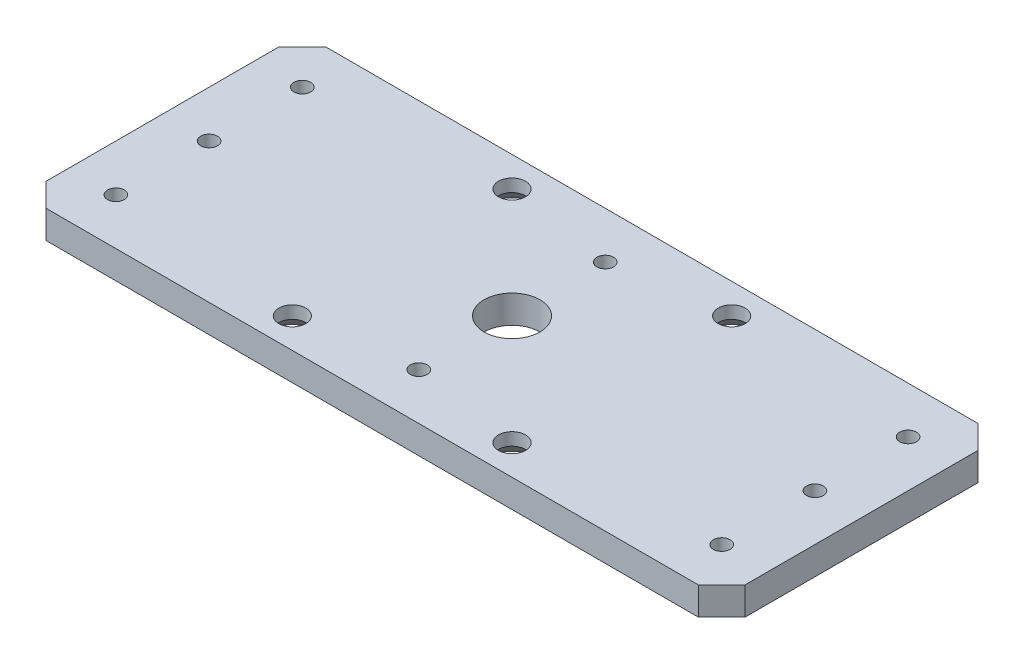
ISO-10303-21;
HEADER;
FILE_DESCRIPTION(('STEP AP214'),'2;1');
FILE_NAME('part.step','',(''),(''),'','','');
FILE_SCHEMA(('AUTOMOTIVE_DESIGN { 1 0 10303 214 1 1 1 1 }'));
ENDSEC;
DATA;
#1=APPLICATION_CONTEXT('core data for automotive mechanical design processes');
#2=APPLICATION_PROTOCOL_DEFINITION('international standard','automotive_design',2000,#1);
#3=PRODUCT_CONTEXT('',#1,'mechanical');
#4=PRODUCT('Part','Part','',(#3));
#5=PRODUCT_RELATED_PRODUCT_CATEGORY('part','',(#4));
#6=PRODUCT_DEFINITION_FORMATION('','',#4);
#7=PRODUCT_DEFINITION_CONTEXT('part definition',#1,'design');
#8=PRODUCT_DEFINITION('design','',#6,#7);
#9=PRODUCT_DEFINITION_SHAPE('','',#8);
#10=(LENGTH_UNIT() NAMED_UNIT(*) SI_UNIT(.MILLI.,.METRE.));
#11=(NAMED_UNIT(*) PLANE_ANGLE_UNIT() SI_UNIT($,.RADIAN.));
#12=(NAMED_UNIT(*) SI_UNIT($,.STERADIAN.) SOLID_ANGLE_UNIT());
#13=UNCERTAINTY_MEASURE_WITH_UNIT(LENGTH_MEASURE(1.E-05),#10,'distance_accuracy_value','');
#14=(GEOMETRIC_REPRESENTATION_CONTEXT(3) GLOBAL_UNCERTAINTY_ASSIGNED_CONTEXT((#13)) GLOBAL_UNIT_ASSIGNED_CONTEXT((#10,
#11,#12)) REPRESENTATION_CONTEXT('',''));
#15=CARTESIAN_POINT('',(0.,0.,0.));
#16=DIRECTION('',(0.,0.,1.));
#17=DIRECTION('',(1.,0.,0.));
#18=AXIS2_PLACEMENT_3D('',#15,#16,#17);
#19=CARTESIAN_POINT('',(0.,94.9999999999997,30.0000000000001));
#20=DIRECTION('',(0.,1.,0.));
#21=DIRECTION('',(-1.,0.,0.));
#22=AXIS2_PLACEMENT_3D('',#19,#20,#21);
#23=PLANE('',#22);
#24=CARTESIAN_POINT('',(-65.,94.9999999999998,9.99999999999992));
#25=DIRECTION('',(0.,1.,0.));
#26=DIRECTION('',(-1.,0.,0.));
#27=AXIS2_PLACEMENT_3D('',#24,#25,#26);
#28=CIRCLE('',#27,1.8);
#29=CARTESIAN_POINT('',(-66.8,94.9999999999998,9.99999999999992));
#30=VERTEX_POINT('',#29);
#31=EDGE_CURVE('E316',#30,#30,#28,.T.);
#32=ORIENTED_EDGE('',*,*,#31,.T.);
#33=EDGE_LOOP('',(#32));
#34=FACE_BOUND('',#33,.T.);
#35=CARTESIAN_POINT('',(-65.,94.9999999999998,30.));
#36=DIRECTION('',(0.,1.,0.));
#37=DIRECTION('',(-1.,0.,0.));
#38=AXIS2_PLACEMENT_3D('',#35,#36,#37);
#39=CIRCLE('',#38,1.8);
#40=CARTESIAN_POINT('',(-66.8,94.9999999999998,30.));
#41=VERTEX_POINT('',#40);
#42=EDGE_CURVE('E310',#41,#41,#39,.T.);
#43=ORIENTED_EDGE('',*,*,#42,.T.);
#44=EDGE_LOOP('',(#43));
#45=FACE_BOUND('',#44,.T.);
#46=CARTESIAN_POINT('',(-65.,94.9999999999998,50.0000000000001));
#47=DIRECTION('',(0.,1.,0.));
#48=DIRECTION('',(-1.,0.,0.));
#49=AXIS2_PLACEMENT_3D('',#46,#47,#48);
#50=CIRCLE('',#49,1.8);
#51=CARTESIAN_POINT('',(-66.8,94.9999999999998,50.0000000000001));
#52=VERTEX_POINT('',#51);
#53=EDGE_CURVE('E304',#52,#52,#50,.T.);
#54=ORIENTED_EDGE('',*,*,#53,.T.);
#55=EDGE_LOOP('',(#54));
#56=FACE_BOUND('',#55,.T.);
#57=CARTESIAN_POINT('',(0.,94.9999999999997,9.99999999999993));
#58=DIRECTION('',(0.,1.,0.));
#59=DIRECTION('',(-1.,0.,0.));
#60=AXIS2_PLACEMENT_3D('',#57,#58,#59);
#61=CIRCLE('',#60,1.8);
#62=CARTESIAN_POINT('',(-1.79999999999999,94.9999999999997,9.99999999999993));
#63=VERTEX_POINT('',#62);
#64=EDGE_CURVE('E298',#63,#63,#61,.T.);
#65=ORIENTED_EDGE('',*,*,#64,.T.);
#66=EDGE_LOOP('',(#65));
#67=FACE_BOUND('',#66,.T.);
#68=CARTESIAN_POINT('',(0.,94.9999999999997,50.0000000000001));
#69=DIRECTION('',(0.,1.,0.));
#70=DIRECTION('',(-1.,0.,0.));
#71=AXIS2_PLACEMENT_3D('',#68,#69,#70);
#72=CIRCLE('',#71,1.8);
#73=CARTESIAN_POINT('',(-1.8,94.9999999999997,50.0000000000001));
#74=VERTEX_POINT('',#73);
#75=EDGE_CURVE('E292',#74,#74,#72,.T.);
#76=ORIENTED_EDGE('',*,*,#75,.T.);
#77=EDGE_LOOP('',(#76));
#78=FACE_BOUND('',#77,.T.);
#79=CARTESIAN_POINT('',(65.,94.9999999999997,9.99999999999993));
#80=DIRECTION('',(0.,1.,0.));
#81=DIRECTION('',(-1.,0.,0.));
#82=AXIS2_PLACEMENT_3D('',#79,#80,#81);
#83=CIRCLE('',#82,1.8);
#84=CARTESIAN_POINT('',(63.2,94.9999999999997,9.99999999999993));
#85=VERTEX_POINT('',#84);
#86=EDGE_CURVE('E286',#85,#85,#83,.T.);
#87=ORIENTED_EDGE('',*,*,#86,.T.);
#88=EDGE_LOOP('',(#87));
#89=FACE_BOUND('',#88,.T.);
#90=CARTESIAN_POINT('',(65.,94.9999999999997,30.));
#91=DIRECTION('',(0.,1.,0.));
#92=DIRECTION('',(-1.,0.,0.));
#93=AXIS2_PLACEMENT_3D('',#90,#91,#92);
#94=CIRCLE('',#93,1.8);
#95=CARTESIAN_POINT('',(63.2,94.9999999999997,30.));
#96=VERTEX_POINT('',#95);
#97=EDGE_CURVE('E280',#96,#96,#94,.T.);
#98=ORIENTED_EDGE('',*,*,#97,.T.);
#99=EDGE_LOOP('',(#98));
#100=FACE_BOUND('',#99,.T.);
#101=CARTESIAN_POINT('',(65.,94.9999999999997,50.0000000000001));
#102=DIRECTION('',(0.,1.,0.));
#103=DIRECTION('',(-1.,0.,0.));
#104=AXIS2_PLACEMENT_3D('',#101,#102,#103);
#105=CIRCLE('',#104,1.8);
#106=CARTESIAN_POINT('',(63.2,94.9999999999997,50.0000000000001));
#107=VERTEX_POINT('',#106);
#108=EDGE_CURVE('E274',#107,#107,#105,.T.);
#109=ORIENTED_EDGE('',*,*,#108,.T.);
#110=EDGE_LOOP('',(#109));
#111=FACE_BOUND('',#110,.T.);
#112=CARTESIAN_POINT('',(23.5699999999999,94.9999999999997,53.5700000000001));
#113=DIRECTION('',(0.,-1.,0.));
#114=DIRECTION('',(0.,0.,-1.));
#115=AXIS2_PLACEMENT_3D('',#112,#113,#114);
#116=CIRCLE('',#115,6.199998);
#117=CARTESIAN_POINT('',(23.5699999999999,94.9999999999997,47.3700020000001));
#118=VERTEX_POINT('',#117);
#119=EDGE_CURVE('E271',#118,#118,#116,.T.);
#120=ORIENTED_EDGE('',*,*,#119,.F.);
#121=EDGE_LOOP('',(#120));
#122=FACE_BOUND('',#121,.T.);
#123=CARTESIAN_POINT('',(-23.5700000000001,94.9999999999997,53.5700000000001));
#124=DIRECTION('',(0.,-1.,0.));
#125=DIRECTION('',(0.,0.,-1.));
#126=AXIS2_PLACEMENT_3D('',#123,#124,#125);
#127=CIRCLE('',#126,6.199998);
#128=CARTESIAN_POINT('',(-23.5700000000001,94.9999999999997,47.3700020000001));
#129=VERTEX_POINT('',#128);
#130=EDGE_CURVE('E262',#129,#129,#127,.T.);
#131=ORIENTED_EDGE('',*,*,#130,.F.);
#132=EDGE_LOOP('',(#131));
#133=FACE_BOUND('',#132,.T.);
#134=CARTESIAN_POINT('',(-23.5700000000001,94.9999999999997,6.43000000000012));
#135=DIRECTION('',(0.,-1.,0.));
#136=DIRECTION('',(0.,0.,-1.));
#137=AXIS2_PLACEMENT_3D('',#134,#135,#136);
#138=CIRCLE('',#137,6.199998);
#139=CARTESIAN_POINT('',(-23.5700000000001,94.9999999999997,0.230002000000121));
#140=VERTEX_POINT('',#139);
#141=EDGE_CURVE('E253',#140,#140,#138,.T.);
#142=ORIENTED_EDGE('',*,*,#141,.F.);
#143=EDGE_LOOP('',(#142));
#144=FACE_BOUND('',#143,.T.);
#145=CARTESIAN_POINT('',(0.,94.9999999999998,30.0000000000001));
#146=DIRECTION('',(0.,1.,0.));
#147=DIRECTION('',(0.,0.,1.));
#148=AXIS2_PLACEMENT_3D('',#145,#146,#147);
#149=CIRCLE('',#148,6.);
#150=CARTESIAN_POINT('',(0.,94.9999999999998,36.0000000000001));
#151=VERTEX_POINT('',#150);
#152=EDGE_CURVE('E135',#151,#151,#149,.T.);
#153=ORIENTED_EDGE('',*,*,#152,.T.);
#154=EDGE_LOOP('',(#153));
#155=FACE_BOUND('',#154,.T.);
#156=DIRECTION('',(1.,0.,0.));
#157=VECTOR('',#156,1.);
#158=CARTESIAN_POINT('',(-75.,94.9999999999997,60.0000000000001));
#159=LINE('',#158,#157);
#160=CARTESIAN_POINT('',(-70.,94.9999999999997,60.0000000000001));
#161=VERTEX_POINT('',#160);
#162=CARTESIAN_POINT('',(70.,94.9999999999997,60.0000000000001));
#163=VERTEX_POINT('',#162);
#164=EDGE_CURVE('E163',#161,#163,#159,.T.);
#165=ORIENTED_EDGE('',*,*,#164,.F.);
#166=DIRECTION('',(0.70710678118655,0.,0.707106781186546));
#167=VECTOR('',#166,1.);
#168=CARTESIAN_POINT('',(-75.,94.9999999999998,55.0000000000001));
#169=LINE('',#168,#167);
#170=CARTESIAN_POINT('',(-75.,94.9999999999998,55.0000000000001));
#171=VERTEX_POINT('',#170);
#172=EDGE_CURVE('E149',#161,#171,#169,.F.);
#173=ORIENTED_EDGE('',*,*,#172,.T.);
#174=DIRECTION('',(0.,0.,1.));
#175=VECTOR('',#174,1.);
#176=CARTESIAN_POINT('',(-75.,94.9999999999998,0.));
#177=LINE('',#176,#175);
#178=CARTESIAN_POINT('',(-75.,94.9999999999998,5.00000000000002));
#179=VERTEX_POINT('',#178);
#180=EDGE_CURVE('E159',#179,#171,#177,.T.);
#181=ORIENTED_EDGE('',*,*,#180,.F.);
#182=DIRECTION('',(-0.707106781186549,0.,0.707106781186547));
#183=VECTOR('',#182,1.);
#184=CARTESIAN_POINT('',(-75.,94.9999999999998,5.00000000000002));
#185=LINE('',#184,#183);
#186=CARTESIAN_POINT('',(-70.,94.9999999999997,0.));
#187=VERTEX_POINT('',#186);
#188=EDGE_CURVE('E129',#179,#187,#185,.F.);
#189=ORIENTED_EDGE('',*,*,#188,.T.);
#190=DIRECTION('',(-1.,0.,0.));
#191=VECTOR('',#190,1.);
#192=CARTESIAN_POINT('',(75.,94.9999999999997,0.));
#193=LINE('',#192,#191);
#194=CARTESIAN_POINT('',(70.,94.9999999999997,0.));
#195=VERTEX_POINT('',#194);
#196=EDGE_CURVE('E158',#195,#187,#193,.T.);
#197=ORIENTED_EDGE('',*,*,#196,.F.);
#198=DIRECTION('',(-0.707106781186547,0.,-0.707106781186549));
#199=VECTOR('',#198,1.);
#200=CARTESIAN_POINT('',(70.,94.9999999999997,0.));
#201=LINE('',#200,#199);
#202=CARTESIAN_POINT('',(75.,94.9999999999997,5.));
#203=VERTEX_POINT('',#202);
#204=EDGE_CURVE('E54',#195,#203,#201,.F.);
#205=ORIENTED_EDGE('',*,*,#204,.T.);
#206=DIRECTION('',(0.,0.,1.));
#207=VECTOR('',#206,1.);
#208=CARTESIAN_POINT('',(75.,94.9999999999997,60.0000000000001));
#209=LINE('',#208,#207);
#210=CARTESIAN_POINT('',(75.,94.9999999999997,55.0000000000001));
#211=VERTEX_POINT('',#210);
#212=EDGE_CURVE('E160',#211,#203,#209,.F.);
#213=ORIENTED_EDGE('',*,*,#212,.F.);
#214=DIRECTION('',(0.70710678118655,0.,-0.707106781186545));
#215=VECTOR('',#214,1.);
#216=CARTESIAN_POINT('',(75.,94.9999999999997,55.0000000000001));
#217=LINE('',#216,#215);
#218=EDGE_CURVE('E62',#211,#163,#217,.F.);
#219=ORIENTED_EDGE('',*,*,#218,.T.);
#220=EDGE_LOOP('',(#165,#173,#181,#189,#197,#205,#213,#219));
#221=FACE_BOUND('',#220,.T.);
#222=CARTESIAN_POINT('',(23.5699999999999,94.9999999999997,6.43000000000012));
#223=DIRECTION('',(0.,-1.,0.));
#224=DIRECTION('',(0.,0.,-1.));
#225=AXIS2_PLACEMENT_3D('',#222,#223,#224);
#226=CIRCLE('',#225,6.199998);
#227=CARTESIAN_POINT('',(23.5699999999999,94.9999999999997,0.230002000000121));
#228=VERTEX_POINT('',#227);
#229=EDGE_CURVE('E177',#228,#228,#226,.T.);
#230=ORIENTED_EDGE('',*,*,#229,.F.);
#231=EDGE_LOOP('',(#230));
#232=FACE_BOUND('',#231,.T.);
#233=ADVANCED_FACE('F39',(#34,#45,#56,#67,#78,#89,#100,#111,#122,#133,#144,#155,#221,#232),#23,.F.);
#234=CARTESIAN_POINT('',(-75.,94.9999999999997,60.0000000000001));
#235=DIRECTION('',(0.,0.,1.));
#236=DIRECTION('',(1.,0.,0.));
#237=AXIS2_PLACEMENT_3D('',#234,#235,#236);
#238=PLANE('',#237);
#239=DIRECTION('',(-1.,0.,0.));
#240=VECTOR('',#239,1.);
#241=CARTESIAN_POINT('',(0.,101.,60.0000000000001));
#242=LINE('',#241,#240);
#243=CARTESIAN_POINT('',(-70.,101.,60.0000000000001));
#244=VERTEX_POINT('',#243);
#245=CARTESIAN_POINT('',(70.,101.,60.0000000000001));
#246=VERTEX_POINT('',#245);
#247=EDGE_CURVE('E184',#244,#246,#242,.F.);
#248=ORIENTED_EDGE('',*,*,#247,.F.);
#249=DIRECTION('',(0.,-1.,0.));
#250=VECTOR('',#249,1.);
#251=CARTESIAN_POINT('',(-70.,94.9999999999997,60.0000000000001));
#252=LINE('',#251,#250);
#253=EDGE_CURVE('E144',#244,#161,#252,.T.);
#254=ORIENTED_EDGE('',*,*,#253,.T.);
#255=ORIENTED_EDGE('',*,*,#164,.T.);
#256=DIRECTION('',(0.,1.,0.));
#257=VECTOR('',#256,1.);
#258=CARTESIAN_POINT('',(70.,94.9999999999995,60.0000000000001));
#259=LINE('',#258,#257);
#260=EDGE_CURVE('E142',#163,#246,#259,.T.);
#261=ORIENTED_EDGE('',*,*,#260,.T.);
#262=EDGE_LOOP('',(#248,#254,#255,#261));
#263=FACE_BOUND('',#262,.T.);
#264=ADVANCED_FACE('F209',(#263),#238,.T.);
#265=CARTESIAN_POINT('',(75.,94.9999999999997,60.0000000000001));
#266=DIRECTION('',(1.,0.,0.));
#267=DIRECTION('',(0.,1.,0.));
#268=AXIS2_PLACEMENT_3D('',#265,#266,#267);
#269=PLANE('',#268);
#270=DIRECTION('',(0.,0.,1.));
#271=VECTOR('',#270,1.);
#272=CARTESIAN_POINT('',(75.,101.,30.0000000000001));
#273=LINE('',#272,#271);
#274=CARTESIAN_POINT('',(75.,101.,55.0000000000001));
#275=VERTEX_POINT('',#274);
#276=CARTESIAN_POINT('',(75.,101.,5.));
#277=VERTEX_POINT('',#276);
#278=EDGE_CURVE('E182',#275,#277,#273,.F.);
#279=ORIENTED_EDGE('',*,*,#278,.F.);
#280=DIRECTION('',(0.,-1.,0.));
#281=VECTOR('',#280,1.);
#282=CARTESIAN_POINT('',(75.,94.9999999999997,55.0000000000001));
#283=LINE('',#282,#281);
#284=EDGE_CURVE('E153',#275,#211,#283,.T.);
#285=ORIENTED_EDGE('',*,*,#284,.T.);
#286=ORIENTED_EDGE('',*,*,#212,.T.);
#287=DIRECTION('',(0.,1.,0.));
#288=VECTOR('',#287,1.);
#289=CARTESIAN_POINT('',(75.,94.9999999999997,5.));
#290=LINE('',#289,#288);
#291=EDGE_CURVE('E151',#203,#277,#290,.T.);
#292=ORIENTED_EDGE('',*,*,#291,.T.);
#293=EDGE_LOOP('',(#279,#285,#286,#292));
#294=FACE_BOUND('',#293,.T.);
#295=ADVANCED_FACE('F216',(#294),#269,.T.);
#296=CARTESIAN_POINT('',(75.,94.9999999999997,0.));
#297=DIRECTION('',(0.,0.,-1.));
#298=DIRECTION('',(-1.,0.,0.));
#299=AXIS2_PLACEMENT_3D('',#296,#297,#298);
#300=PLANE('',#299);
#301=DIRECTION('',(-1.,0.,0.));
#302=VECTOR('',#301,1.);
#303=CARTESIAN_POINT('',(0.,101.,0.));
#304=LINE('',#303,#302);
#305=CARTESIAN_POINT('',(70.,101.,0.));
#306=VERTEX_POINT('',#305);
#307=CARTESIAN_POINT('',(-70.,101.,0.));
#308=VERTEX_POINT('',#307);
#309=EDGE_CURVE('E112',#306,#308,#304,.T.);
#310=ORIENTED_EDGE('',*,*,#309,.F.);
#311=DIRECTION('',(0.,-1.,0.));
#312=VECTOR('',#311,1.);
#313=CARTESIAN_POINT('',(70.,94.9999999999997,0.));
#314=LINE('',#313,#312);
#315=EDGE_CURVE('E11',#306,#195,#314,.T.);
#316=ORIENTED_EDGE('',*,*,#315,.T.);
#317=ORIENTED_EDGE('',*,*,#196,.T.);
#318=DIRECTION('',(0.,1.,0.));
#319=VECTOR('',#318,1.);
#320=CARTESIAN_POINT('',(-70.,94.9999999999999,0.));
#321=LINE('',#320,#319);
#322=EDGE_CURVE('E47',#187,#308,#321,.T.);
#323=ORIENTED_EDGE('',*,*,#322,.T.);
#324=EDGE_LOOP('',(#310,#316,#317,#323));
#325=FACE_BOUND('',#324,.T.);
#326=ADVANCED_FACE('F156',(#325),#300,.T.);
#327=CARTESIAN_POINT('',(-75.,94.9999999999998,0.));
#328=DIRECTION('',(-1.,0.,0.));
#329=DIRECTION('',(0.,-1.,0.));
#330=AXIS2_PLACEMENT_3D('',#327,#328,#329);
#331=PLANE('',#330);
#332=ORIENTED_EDGE('',*,*,#180,.T.);
#333=DIRECTION('',(0.,1.,0.));
#334=VECTOR('',#333,1.);
#335=CARTESIAN_POINT('',(-75.,94.9999999999998,55.0000000000001));
#336=LINE('',#335,#334);
#337=CARTESIAN_POINT('',(-75.,101.,55.0000000000001));
#338=VERTEX_POINT('',#337);
#339=EDGE_CURVE('E117',#171,#338,#336,.T.);
#340=ORIENTED_EDGE('',*,*,#339,.T.);
#341=DIRECTION('',(0.,0.,1.));
#342=VECTOR('',#341,1.);
#343=CARTESIAN_POINT('',(-75.,101.,30.0000000000001));
#344=LINE('',#343,#342);
#345=CARTESIAN_POINT('',(-75.,101.,5.00000000000002));
#346=VERTEX_POINT('',#345);
#347=EDGE_CURVE('E110',#346,#338,#344,.T.);
#348=ORIENTED_EDGE('',*,*,#347,.F.);
#349=DIRECTION('',(0.,-1.,0.));
#350=VECTOR('',#349,1.);
#351=CARTESIAN_POINT('',(-75.,94.9999999999998,5.00000000000002));
#352=LINE('',#351,#350);
#353=EDGE_CURVE('E124',#346,#179,#352,.T.);
#354=ORIENTED_EDGE('',*,*,#353,.T.);
#355=EDGE_LOOP('',(#332,#340,#348,#354));
#356=FACE_BOUND('',#355,.T.);
#357=ADVANCED_FACE('F123',(#356),#331,.T.);
#358=CARTESIAN_POINT('',(0.,98.2999999999998,30.0000000000001));
#359=DIRECTION('',(0.,1.,0.));
#360=DIRECTION('',(0.,0.,1.));
#361=AXIS2_PLACEMENT_3D('',#358,#359,#360);
#362=CYLINDRICAL_SURFACE('',#361,6.);
#363=CARTESIAN_POINT('',(0.,101.,30.0000000000001));
#364=DIRECTION('',(0.,1.,0.));
#365=DIRECTION('',(0.,0.,1.));
#366=AXIS2_PLACEMENT_3D('',#363,#364,#365);
#367=CIRCLE('',#366,6.);
#368=CARTESIAN_POINT('',(0.,101.,36.0000000000001));
#369=VERTEX_POINT('',#368);
#370=EDGE_CURVE('E127',#369,#369,#367,.F.);
#371=ORIENTED_EDGE('',*,*,#370,.F.);
#372=EDGE_LOOP('',(#371));
#373=FACE_BOUND('',#372,.T.);
#374=ORIENTED_EDGE('',*,*,#152,.F.);
#375=EDGE_LOOP('',(#374));
#376=FACE_BOUND('',#375,.T.);
#377=ADVANCED_FACE('F192',(#373,#376),#362,.F.);
#378=CARTESIAN_POINT('',(0.,101.,30.0000000000001));
#379=DIRECTION('',(0.,1.,0.));
#380=DIRECTION('',(-1.,0.,0.));
#381=AXIS2_PLACEMENT_3D('',#378,#379,#380);
#382=PLANE('',#381);
#383=CARTESIAN_POINT('',(-65.,101.,9.99999999999992));
#384=DIRECTION('',(0.,1.,0.));
#385=DIRECTION('',(0.,0.,1.));
#386=AXIS2_PLACEMENT_3D('',#383,#384,#385);
#387=CIRCLE('',#386,1.8);
#388=CARTESIAN_POINT('',(-65.,101.,11.7999999999999));
#389=VERTEX_POINT('',#388);
#390=EDGE_CURVE('E318',#389,#389,#387,.T.);
#391=ORIENTED_EDGE('',*,*,#390,.F.);
#392=EDGE_LOOP('',(#391));
#393=FACE_BOUND('',#392,.T.);
#394=CARTESIAN_POINT('',(-65.,101.,30.));
#395=DIRECTION('',(0.,1.,0.));
#396=DIRECTION('',(0.,0.,1.));
#397=AXIS2_PLACEMENT_3D('',#394,#395,#396);
#398=CIRCLE('',#397,1.8);
#399=CARTESIAN_POINT('',(-65.,101.,31.8));
#400=VERTEX_POINT('',#399);
#401=EDGE_CURVE('E313',#400,#400,#398,.T.);
#402=ORIENTED_EDGE('',*,*,#401,.F.);
#403=EDGE_LOOP('',(#402));
#404=FACE_BOUND('',#403,.T.);
#405=CARTESIAN_POINT('',(-65.,101.,50.0000000000001));
#406=DIRECTION('',(0.,1.,0.));
#407=DIRECTION('',(0.,0.,1.));
#408=AXIS2_PLACEMENT_3D('',#405,#406,#407);
#409=CIRCLE('',#408,1.8);
#410=CARTESIAN_POINT('',(-65.,101.,51.8000000000001));
#411=VERTEX_POINT('',#410);
#412=EDGE_CURVE('E307',#411,#411,#409,.T.);
#413=ORIENTED_EDGE('',*,*,#412,.F.);
#414=EDGE_LOOP('',(#413));
#415=FACE_BOUND('',#414,.T.);
#416=CARTESIAN_POINT('',(0.,101.,9.99999999999993));
#417=DIRECTION('',(0.,1.,0.));
#418=DIRECTION('',(0.,0.,1.));
#419=AXIS2_PLACEMENT_3D('',#416,#417,#418);
#420=CIRCLE('',#419,1.8);
#421=CARTESIAN_POINT('',(0.,101.,11.7999999999999));
#422=VERTEX_POINT('',#421);
#423=EDGE_CURVE('E301',#422,#422,#420,.T.);
#424=ORIENTED_EDGE('',*,*,#423,.F.);
#425=EDGE_LOOP('',(#424));
#426=FACE_BOUND('',#425,.T.);
#427=CARTESIAN_POINT('',(0.,101.,50.0000000000001));
#428=DIRECTION('',(0.,1.,0.));
#429=DIRECTION('',(0.,0.,1.));
#430=AXIS2_PLACEMENT_3D('',#427,#428,#429);
#431=CIRCLE('',#430,1.8);
#432=CARTESIAN_POINT('',(0.,101.,51.8000000000001));
#433=VERTEX_POINT('',#432);
#434=EDGE_CURVE('E295',#433,#433,#431,.T.);
#435=ORIENTED_EDGE('',*,*,#434,.F.);
#436=EDGE_LOOP('',(#435));
#437=FACE_BOUND('',#436,.T.);
#438=CARTESIAN_POINT('',(65.,101.,9.99999999999993));
#439=DIRECTION('',(0.,1.,0.));
#440=DIRECTION('',(0.,0.,1.));
#441=AXIS2_PLACEMENT_3D('',#438,#439,#440);
#442=CIRCLE('',#441,1.8);
#443=CARTESIAN_POINT('',(65.,101.,11.7999999999999));
#444=VERTEX_POINT('',#443);
#445=EDGE_CURVE('E289',#444,#444,#442,.T.);
#446=ORIENTED_EDGE('',*,*,#445,.F.);
#447=EDGE_LOOP('',(#446));
#448=FACE_BOUND('',#447,.T.);
#449=CARTESIAN_POINT('',(65.,101.,30.));
#450=DIRECTION('',(0.,1.,0.));
#451=DIRECTION('',(0.,0.,1.));
#452=AXIS2_PLACEMENT_3D('',#449,#450,#451);
#453=CIRCLE('',#452,1.8);
#454=CARTESIAN_POINT('',(65.,101.,31.8));
#455=VERTEX_POINT('',#454);
#456=EDGE_CURVE('E283',#455,#455,#453,.T.);
#457=ORIENTED_EDGE('',*,*,#456,.F.);
#458=EDGE_LOOP('',(#457));
#459=FACE_BOUND('',#458,.T.);
#460=CARTESIAN_POINT('',(65.,101.,50.0000000000001));
#461=DIRECTION('',(0.,1.,0.));
#462=DIRECTION('',(0.,0.,1.));
#463=AXIS2_PLACEMENT_3D('',#460,#461,#462);
#464=CIRCLE('',#463,1.8);
#465=CARTESIAN_POINT('',(65.,101.,51.8000000000001));
#466=VERTEX_POINT('',#465);
#467=EDGE_CURVE('E277',#466,#466,#464,.T.);
#468=ORIENTED_EDGE('',*,*,#467,.F.);
#469=EDGE_LOOP('',(#468));
#470=FACE_BOUND('',#469,.T.);
#471=CARTESIAN_POINT('',(23.5699999999999,101.,53.5700000000001));
#472=DIRECTION('',(0.,1.,0.));
#473=DIRECTION('',(-1.,0.,0.));
#474=AXIS2_PLACEMENT_3D('',#471,#472,#473);
#475=CIRCLE('',#474,2.9);
#476=CARTESIAN_POINT('',(20.6699999999999,101.,53.5700000000001));
#477=VERTEX_POINT('',#476);
#478=EDGE_CURVE('E265',#477,#477,#475,.T.);
#479=ORIENTED_EDGE('',*,*,#478,.F.);
#480=EDGE_LOOP('',(#479));
#481=FACE_BOUND('',#480,.T.);
#482=CARTESIAN_POINT('',(-23.5700000000001,101.,53.5700000000001));
#483=DIRECTION('',(0.,1.,0.));
#484=DIRECTION('',(-1.,0.,0.));
#485=AXIS2_PLACEMENT_3D('',#482,#483,#484);
#486=CIRCLE('',#485,2.9);
#487=CARTESIAN_POINT('',(-26.4700000000001,101.,53.5700000000001));
#488=VERTEX_POINT('',#487);
#489=EDGE_CURVE('E256',#488,#488,#486,.T.);
#490=ORIENTED_EDGE('',*,*,#489,.F.);
#491=EDGE_LOOP('',(#490));
#492=FACE_BOUND('',#491,.T.);
#493=CARTESIAN_POINT('',(-23.5700000000001,101.,6.43000000000012));
#494=DIRECTION('',(0.,1.,0.));
#495=DIRECTION('',(-1.,0.,0.));
#496=AXIS2_PLACEMENT_3D('',#493,#494,#495);
#497=CIRCLE('',#496,2.9);
#498=CARTESIAN_POINT('',(-26.4700000000001,101.,6.43000000000012));
#499=VERTEX_POINT('',#498);
#500=EDGE_CURVE('E246',#499,#499,#497,.T.);
#501=ORIENTED_EDGE('',*,*,#500,.F.);
#502=EDGE_LOOP('',(#501));
#503=FACE_BOUND('',#502,.T.);
#504=CARTESIAN_POINT('',(23.5699999999999,101.,6.43000000000012));
#505=DIRECTION('',(0.,1.,0.));
#506=DIRECTION('',(-1.,0.,0.));
#507=AXIS2_PLACEMENT_3D('',#504,#505,#506);
#508=CIRCLE('',#507,2.9);
#509=CARTESIAN_POINT('',(20.6699999999999,101.,6.43000000000012));
#510=VERTEX_POINT('',#509);
#511=EDGE_CURVE('E168',#510,#510,#508,.T.);
#512=ORIENTED_EDGE('',*,*,#511,.F.);
#513=EDGE_LOOP('',(#512));
#514=FACE_BOUND('',#513,.T.);
#515=ORIENTED_EDGE('',*,*,#370,.T.);
#516=EDGE_LOOP('',(#515));
#517=FACE_BOUND('',#516,.T.);
#518=ORIENTED_EDGE('',*,*,#347,.T.);
#519=DIRECTION('',(-0.70710678118655,0.,-0.707106781186546));
#520=VECTOR('',#519,1.);
#521=CARTESIAN_POINT('',(-49.9999999999998,101.,80.0000000000002));
#522=LINE('',#521,#520);
#523=EDGE_CURVE('E140',#338,#244,#522,.F.);
#524=ORIENTED_EDGE('',*,*,#523,.T.);
#525=ORIENTED_EDGE('',*,*,#247,.T.);
#526=DIRECTION('',(-0.70710678118655,0.,0.707106781186545));
#527=VECTOR('',#526,1.);
#528=CARTESIAN_POINT('',(49.9999999999997,101.,80.0000000000002));
#529=LINE('',#528,#527);
#530=EDGE_CURVE('E138',#246,#275,#529,.F.);
#531=ORIENTED_EDGE('',*,*,#530,.T.);
#532=ORIENTED_EDGE('',*,*,#278,.T.);
#533=DIRECTION('',(0.707106781186547,0.,0.707106781186549));
#534=VECTOR('',#533,1.);
#535=CARTESIAN_POINT('',(50.0000000000002,101.,-19.9999999999999));
#536=LINE('',#535,#534);
#537=EDGE_CURVE('E116',#277,#306,#536,.F.);
#538=ORIENTED_EDGE('',*,*,#537,.T.);
#539=ORIENTED_EDGE('',*,*,#309,.T.);
#540=DIRECTION('',(0.707106781186549,0.,-0.707106781186547));
#541=VECTOR('',#540,1.);
#542=CARTESIAN_POINT('',(-49.9999999999999,101.,-20.));
#543=LINE('',#542,#541);
#544=EDGE_CURVE('E107',#308,#346,#543,.F.);
#545=ORIENTED_EDGE('',*,*,#544,.T.);
#546=EDGE_LOOP('',(#518,#524,#525,#531,#532,#538,#539,#545));
#547=FACE_BOUND('',#546,.T.);
#548=ADVANCED_FACE('F109',(#393,#404,#415,#426,#437,#448,#459,#470,#481,#492,#503,#514,#517,
#547),#382,.T.);
#549=CARTESIAN_POINT('',(23.5699999999999,94.9999999999997,6.43000000000012));
#550=DIRECTION('',(0.,-1.,0.));
#551=DIRECTION('',(0.,0.,-1.));
#552=AXIS2_PLACEMENT_3D('',#549,#550,#551);
#553=CYLINDRICAL_SURFACE('',#552,2.9);
#554=CARTESIAN_POINT('',(23.5699999999999,98.2999979999997,6.43000000000012));
#555=DIRECTION('',(0.,-1.,0.));
#556=DIRECTION('',(0.,0.,-1.));
#557=AXIS2_PLACEMENT_3D('',#554,#555,#556);
#558=CIRCLE('',#557,2.9);
#559=CARTESIAN_POINT('',(23.5699999999999,98.2999979999997,3.53000000000012));
#560=VERTEX_POINT('',#559);
#561=EDGE_CURVE('E172',#560,#560,#558,.T.);
#562=ORIENTED_EDGE('',*,*,#561,.T.);
#563=EDGE_LOOP('',(#562));
#564=FACE_BOUND('',#563,.T.);
#565=ORIENTED_EDGE('',*,*,#511,.T.);
#566=EDGE_LOOP('',(#565));
#567=FACE_BOUND('',#566,.T.);
#568=ADVANCED_FACE('F202',(#564,#567),#553,.F.);
#569=CARTESIAN_POINT('',(23.5699999999999,94.9999999999997,6.43000000000012));
#570=DIRECTION('',(0.,-1.,0.));
#571=DIRECTION('',(0.,0.,-1.));
#572=AXIS2_PLACEMENT_3D('',#569,#570,#571);
#573=CONICAL_SURFACE('',#572,6.199998,0.785398163397448);
#574=ORIENTED_EDGE('',*,*,#561,.F.);
#575=EDGE_LOOP('',(#574));
#576=FACE_BOUND('',#575,.T.);
#577=ORIENTED_EDGE('',*,*,#229,.T.);
#578=EDGE_LOOP('',(#577));
#579=FACE_BOUND('',#578,.T.);
#580=ADVANCED_FACE('F349',(#576,#579),#573,.F.);
#581=CARTESIAN_POINT('',(-23.5700000000001,94.9999999999997,6.43000000000012));
#582=DIRECTION('',(0.,-1.,0.));
#583=DIRECTION('',(0.,0.,-1.));
#584=AXIS2_PLACEMENT_3D('',#581,#582,#583);
#585=CYLINDRICAL_SURFACE('',#584,2.9);
#586=CARTESIAN_POINT('',(-23.5700000000001,98.2999979999997,6.43000000000012));
#587=DIRECTION('',(0.,-1.,0.));
#588=DIRECTION('',(0.,0.,-1.));
#589=AXIS2_PLACEMENT_3D('',#586,#587,#588);
#590=CIRCLE('',#589,2.9);
#591=CARTESIAN_POINT('',(-23.5700000000001,98.2999979999997,3.53000000000012));
#592=VERTEX_POINT('',#591);
#593=EDGE_CURVE('E248',#592,#592,#590,.T.);
#594=ORIENTED_EDGE('',*,*,#593,.T.);
#595=EDGE_LOOP('',(#594));
#596=FACE_BOUND('',#595,.T.);
#597=ORIENTED_EDGE('',*,*,#500,.T.);
#598=EDGE_LOOP('',(#597));
#599=FACE_BOUND('',#598,.T.);
#600=ADVANCED_FACE('F346',(#596,#599),#585,.F.);
#601=CARTESIAN_POINT('',(-23.5700000000001,94.9999999999997,6.43000000000012));
#602=DIRECTION('',(0.,-1.,0.));
#603=DIRECTION('',(0.,0.,-1.));
#604=AXIS2_PLACEMENT_3D('',#601,#602,#603);
#605=CONICAL_SURFACE('',#604,6.199998,0.785398163397448);
#606=ORIENTED_EDGE('',*,*,#593,.F.);
#607=EDGE_LOOP('',(#606));
#608=FACE_BOUND('',#607,.T.);
#609=ORIENTED_EDGE('',*,*,#141,.T.);
#610=EDGE_LOOP('',(#609));
#611=FACE_BOUND('',#610,.T.);
#612=ADVANCED_FACE('F348',(#608,#611),#605,.F.);
#613=CARTESIAN_POINT('',(-23.5700000000001,94.9999999999997,53.5700000000001));
#614=DIRECTION('',(0.,-1.,0.));
#615=DIRECTION('',(0.,0.,-1.));
#616=AXIS2_PLACEMENT_3D('',#613,#614,#615);
#617=CYLINDRICAL_SURFACE('',#616,2.9);
#618=CARTESIAN_POINT('',(-23.5700000000001,98.2999979999997,53.5700000000001));
#619=DIRECTION('',(0.,-1.,0.));
#620=DIRECTION('',(0.,0.,-1.));
#621=AXIS2_PLACEMENT_3D('',#618,#619,#620);
#622=CIRCLE('',#621,2.9);
#623=CARTESIAN_POINT('',(-23.5700000000001,98.2999979999997,50.6700000000001));
#624=VERTEX_POINT('',#623);
#625=EDGE_CURVE('E259',#624,#624,#622,.T.);
#626=ORIENTED_EDGE('',*,*,#625,.T.);
#627=EDGE_LOOP('',(#626));
#628=FACE_BOUND('',#627,.T.);
#629=ORIENTED_EDGE('',*,*,#489,.T.);
#630=EDGE_LOOP('',(#629));
#631=FACE_BOUND('',#630,.T.);
#632=ADVANCED_FACE('F356',(#628,#631),#617,.F.);
#633=CARTESIAN_POINT('',(-23.5700000000001,94.9999999999997,53.5700000000001));
#634=DIRECTION('',(0.,-1.,0.));
#635=DIRECTION('',(0.,0.,-1.));
#636=AXIS2_PLACEMENT_3D('',#633,#634,#635);
#637=CONICAL_SURFACE('',#636,6.199998,0.785398163397448);
#638=ORIENTED_EDGE('',*,*,#625,.F.);
#639=EDGE_LOOP('',(#638));
#640=FACE_BOUND('',#639,.T.);
#641=ORIENTED_EDGE('',*,*,#130,.T.);
#642=EDGE_LOOP('',(#641));
#643=FACE_BOUND('',#642,.T.);
#644=ADVANCED_FACE('F394',(#640,#643),#637,.F.);
#645=CARTESIAN_POINT('',(23.5699999999999,94.9999999999997,53.5700000000001));
#646=DIRECTION('',(0.,-1.,0.));
#647=DIRECTION('',(0.,0.,-1.));
#648=AXIS2_PLACEMENT_3D('',#645,#646,#647);
#649=CYLINDRICAL_SURFACE('',#648,2.9);
#650=CARTESIAN_POINT('',(23.5699999999999,98.2999979999997,53.5700000000001));
#651=DIRECTION('',(0.,-1.,0.));
#652=DIRECTION('',(0.,0.,-1.));
#653=AXIS2_PLACEMENT_3D('',#650,#651,#652);
#654=CIRCLE('',#653,2.9);
#655=CARTESIAN_POINT('',(23.5699999999999,98.2999979999997,50.6700000000001));
#656=VERTEX_POINT('',#655);
#657=EDGE_CURVE('E268',#656,#656,#654,.T.);
#658=ORIENTED_EDGE('',*,*,#657,.T.);
#659=EDGE_LOOP('',(#658));
#660=FACE_BOUND('',#659,.T.);
#661=ORIENTED_EDGE('',*,*,#478,.T.);
#662=EDGE_LOOP('',(#661));
#663=FACE_BOUND('',#662,.T.);
#664=ADVANCED_FACE('F403',(#660,#663),#649,.F.);
#665=CARTESIAN_POINT('',(23.5699999999999,94.9999999999997,53.5700000000001));
#666=DIRECTION('',(0.,-1.,0.));
#667=DIRECTION('',(0.,0.,-1.));
#668=AXIS2_PLACEMENT_3D('',#665,#666,#667);
#669=CONICAL_SURFACE('',#668,6.199998,0.785398163397448);
#670=ORIENTED_EDGE('',*,*,#657,.F.);
#671=EDGE_LOOP('',(#670));
#672=FACE_BOUND('',#671,.T.);
#673=ORIENTED_EDGE('',*,*,#119,.T.);
#674=EDGE_LOOP('',(#673));
#675=FACE_BOUND('',#674,.T.);
#676=ADVANCED_FACE('F226',(#672,#675),#669,.F.);
#677=CARTESIAN_POINT('',(-75.,94.9999999999998,55.0000000000001));
#678=DIRECTION('',(0.707106781186545,0.,-0.707106781186549));
#679=DIRECTION('',(0.,1.,0.));
#680=AXIS2_PLACEMENT_3D('',#677,#678,#679);
#681=PLANE('',#680);
#682=ORIENTED_EDGE('',*,*,#172,.F.);
#683=ORIENTED_EDGE('',*,*,#253,.F.);
#684=ORIENTED_EDGE('',*,*,#523,.F.);
#685=ORIENTED_EDGE('',*,*,#339,.F.);
#686=EDGE_LOOP('',(#682,#683,#684,#685));
#687=FACE_BOUND('',#686,.T.);
#688=ADVANCED_FACE('F222',(#687),#681,.F.);
#689=CARTESIAN_POINT('',(75.,94.9999999999997,55.0000000000001));
#690=DIRECTION('',(-0.707106781186545,0.,-0.707106781186551));
#691=DIRECTION('',(0.,-1.,0.));
#692=AXIS2_PLACEMENT_3D('',#689,#690,#691);
#693=PLANE('',#692);
#694=ORIENTED_EDGE('',*,*,#530,.F.);
#695=ORIENTED_EDGE('',*,*,#260,.F.);
#696=ORIENTED_EDGE('',*,*,#218,.F.);
#697=ORIENTED_EDGE('',*,*,#284,.F.);
#698=EDGE_LOOP('',(#694,#695,#696,#697));
#699=FACE_BOUND('',#698,.T.);
#700=ADVANCED_FACE('F225',(#699),#693,.F.);
#701=CARTESIAN_POINT('',(70.,94.9999999999997,0.));
#702=DIRECTION('',(-0.707106781186548,0.,0.707106781186546));
#703=DIRECTION('',(0.,-1.,0.));
#704=AXIS2_PLACEMENT_3D('',#701,#702,#703);
#705=PLANE('',#704);
#706=ORIENTED_EDGE('',*,*,#537,.F.);
#707=ORIENTED_EDGE('',*,*,#291,.F.);
#708=ORIENTED_EDGE('',*,*,#204,.F.);
#709=ORIENTED_EDGE('',*,*,#315,.F.);
#710=EDGE_LOOP('',(#706,#707,#708,#709));
#711=FACE_BOUND('',#710,.T.);
#712=ADVANCED_FACE('F229',(#711),#705,.F.);
#713=CARTESIAN_POINT('',(-75.,94.9999999999998,5.00000000000002));
#714=DIRECTION('',(0.707106781186546,0.,0.707106781186548));
#715=DIRECTION('',(0.,-1.,0.));
#716=AXIS2_PLACEMENT_3D('',#713,#714,#715);
#717=PLANE('',#716);
#718=ORIENTED_EDGE('',*,*,#544,.F.);
#719=ORIENTED_EDGE('',*,*,#322,.F.);
#720=ORIENTED_EDGE('',*,*,#188,.F.);
#721=ORIENTED_EDGE('',*,*,#353,.F.);
#722=EDGE_LOOP('',(#718,#719,#720,#721));
#723=FACE_BOUND('',#722,.T.);
#724=ADVANCED_FACE('F41',(#723),#717,.F.);
#725=CARTESIAN_POINT('',(65.,101.,50.0000000000001));
#726=DIRECTION('',(0.,1.,0.));
#727=DIRECTION('',(0.,0.,1.));
#728=AXIS2_PLACEMENT_3D('',#725,#726,#727);
#729=CYLINDRICAL_SURFACE('',#728,1.8);
#730=ORIENTED_EDGE('',*,*,#108,.F.);
#731=EDGE_LOOP('',(#730));
#732=FACE_BOUND('',#731,.T.);
#733=ORIENTED_EDGE('',*,*,#467,.T.);
#734=EDGE_LOOP('',(#733));
#735=FACE_BOUND('',#734,.T.);
#736=ADVANCED_FACE('F235',(#732,#735),#729,.F.);
#737=CARTESIAN_POINT('',(65.,101.,30.));
#738=DIRECTION('',(0.,1.,0.));
#739=DIRECTION('',(0.,0.,1.));
#740=AXIS2_PLACEMENT_3D('',#737,#738,#739);
#741=CYLINDRICAL_SURFACE('',#740,1.8);
#742=ORIENTED_EDGE('',*,*,#97,.F.);
#743=EDGE_LOOP('',(#742));
#744=FACE_BOUND('',#743,.T.);
#745=ORIENTED_EDGE('',*,*,#456,.T.);
#746=EDGE_LOOP('',(#745));
#747=FACE_BOUND('',#746,.T.);
#748=ADVANCED_FACE('F474',(#744,#747),#741,.F.);
#749=CARTESIAN_POINT('',(65.,101.,9.99999999999993));
#750=DIRECTION('',(0.,1.,0.));
#751=DIRECTION('',(0.,0.,1.));
#752=AXIS2_PLACEMENT_3D('',#749,#750,#751);
#753=CYLINDRICAL_SURFACE('',#752,1.8);
#754=ORIENTED_EDGE('',*,*,#86,.F.);
#755=EDGE_LOOP('',(#754));
#756=FACE_BOUND('',#755,.T.);
#757=ORIENTED_EDGE('',*,*,#445,.T.);
#758=EDGE_LOOP('',(#757));
#759=FACE_BOUND('',#758,.T.);
#760=ADVANCED_FACE('F481',(#756,#759),#753,.F.);
#761=CARTESIAN_POINT('',(0.,101.,50.0000000000001));
#762=DIRECTION('',(0.,1.,0.));
#763=DIRECTION('',(0.,0.,1.));
#764=AXIS2_PLACEMENT_3D('',#761,#762,#763);
#765=CYLINDRICAL_SURFACE('',#764,1.8);
#766=ORIENTED_EDGE('',*,*,#75,.F.);
#767=EDGE_LOOP('',(#766));
#768=FACE_BOUND('',#767,.T.);
#769=ORIENTED_EDGE('',*,*,#434,.T.);
#770=EDGE_LOOP('',(#769));
#771=FACE_BOUND('',#770,.T.);
#772=ADVANCED_FACE('F489',(#768,#771),#765,.F.);
#773=CARTESIAN_POINT('',(0.,101.,9.99999999999993));
#774=DIRECTION('',(0.,1.,0.));
#775=DIRECTION('',(0.,0.,1.));
#776=AXIS2_PLACEMENT_3D('',#773,#774,#775);
#777=CYLINDRICAL_SURFACE('',#776,1.8);
#778=ORIENTED_EDGE('',*,*,#64,.F.);
#779=EDGE_LOOP('',(#778));
#780=FACE_BOUND('',#779,.T.);
#781=ORIENTED_EDGE('',*,*,#423,.T.);
#782=EDGE_LOOP('',(#781));
#783=FACE_BOUND('',#782,.T.);
#784=ADVANCED_FACE('F497',(#780,#783),#777,.F.);
#785=CARTESIAN_POINT('',(-65.,101.,50.0000000000001));
#786=DIRECTION('',(0.,1.,0.));
#787=DIRECTION('',(0.,0.,1.));
#788=AXIS2_PLACEMENT_3D('',#785,#786,#787);
#789=CYLINDRICAL_SURFACE('',#788,1.8);
#790=ORIENTED_EDGE('',*,*,#53,.F.);
#791=EDGE_LOOP('',(#790));
#792=FACE_BOUND('',#791,.T.);
#793=ORIENTED_EDGE('',*,*,#412,.T.);
#794=EDGE_LOOP('',(#793));
#795=FACE_BOUND('',#794,.T.);
#796=ADVANCED_FACE('F505',(#792,#795),#789,.F.);
#797=CARTESIAN_POINT('',(-65.,101.,30.));
#798=DIRECTION('',(0.,1.,0.));
#799=DIRECTION('',(0.,0.,1.));
#800=AXIS2_PLACEMENT_3D('',#797,#798,#799);
#801=CYLINDRICAL_SURFACE('',#800,1.8);
#802=ORIENTED_EDGE('',*,*,#42,.F.);
#803=EDGE_LOOP('',(#802));
#804=FACE_BOUND('',#803,.T.);
#805=ORIENTED_EDGE('',*,*,#401,.T.);
#806=EDGE_LOOP('',(#805));
#807=FACE_BOUND('',#806,.T.);
#808=ADVANCED_FACE('F513',(#804,#807),#801,.F.);
#809=CARTESIAN_POINT('',(-65.,101.,9.99999999999992));
#810=DIRECTION('',(0.,1.,0.));
#811=DIRECTION('',(0.,0.,1.));
#812=AXIS2_PLACEMENT_3D('',#809,#810,#811);
#813=CYLINDRICAL_SURFACE('',#812,1.8);
#814=ORIENTED_EDGE('',*,*,#31,.F.);
#815=EDGE_LOOP('',(#814));
#816=FACE_BOUND('',#815,.T.);
#817=ORIENTED_EDGE('',*,*,#390,.T.);
#818=EDGE_LOOP('',(#817));
#819=FACE_BOUND('',#818,.T.);
#820=ADVANCED_FACE('F322',(#816,#819),#813,.F.);
#821=CLOSED_SHELL('',(#233,#264,#295,#326,#357,#377,#548,#568,#580,#600,#612,#632,#644,#664,
#676,#688,#700,#712,#724,#736,#748,#760,#772,#784,#796,#808,#820));
#822=MANIFOLD_SOLID_BREP('B2',#821);
#823=ADVANCED_BREP_SHAPE_REPRESENTATION('',(#18,#822),#14);
#824=SHAPE_DEFINITION_REPRESENTATION(#9,#823);
ENDSEC;
END-ISO-10303-21;
